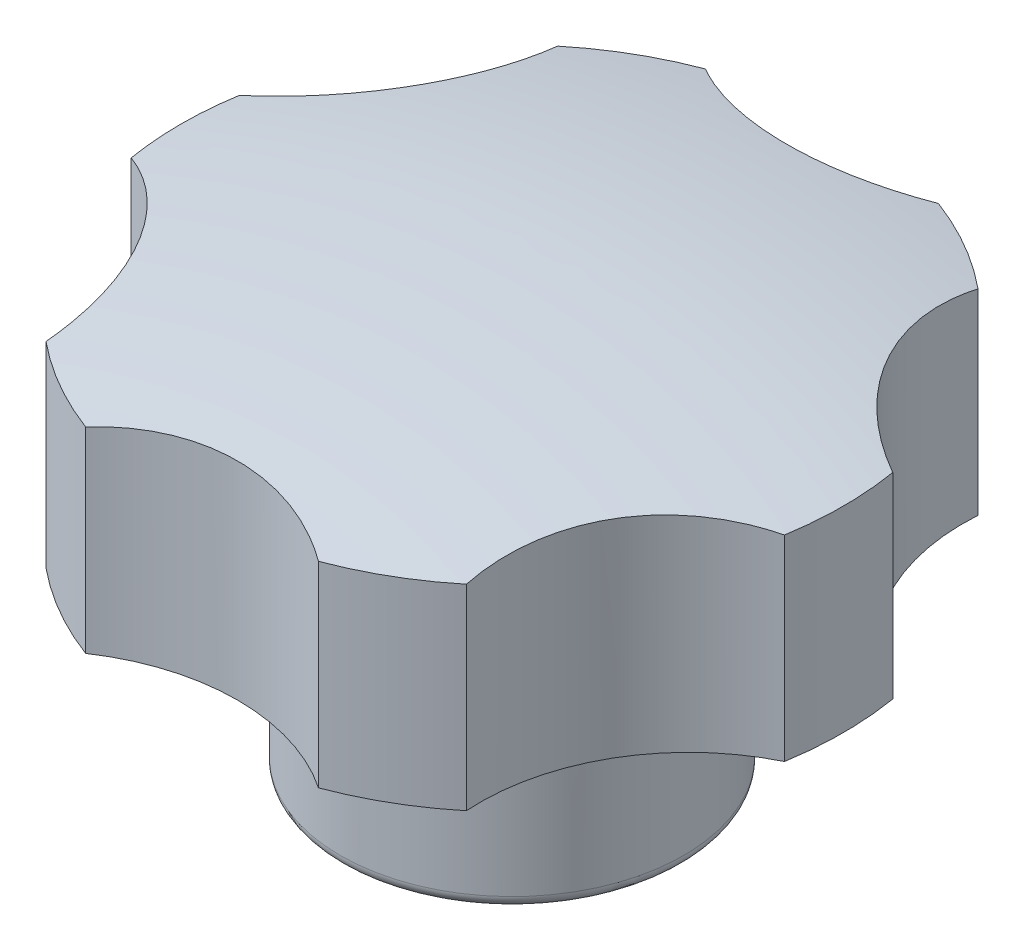
ISO-10303-21;
HEADER;
FILE_DESCRIPTION(('STEP AP214'),'2;1');
FILE_NAME('part.step','',(''),(''),'','','');
FILE_SCHEMA(('AUTOMOTIVE_DESIGN { 1 0 10303 214 1 1 1 1 }'));
ENDSEC;
DATA;
#1=APPLICATION_CONTEXT('core data for automotive mechanical design processes');
#2=APPLICATION_PROTOCOL_DEFINITION('international standard','automotive_design',2000,#1);
#3=PRODUCT_CONTEXT('',#1,'mechanical');
#4=PRODUCT('Part','Part','',(#3));
#5=PRODUCT_RELATED_PRODUCT_CATEGORY('part','',(#4));
#6=PRODUCT_DEFINITION_FORMATION('','',#4);
#7=PRODUCT_DEFINITION_CONTEXT('part definition',#1,'design');
#8=PRODUCT_DEFINITION('design','',#6,#7);
#9=PRODUCT_DEFINITION_SHAPE('','',#8);
#10=(LENGTH_UNIT() NAMED_UNIT(*) SI_UNIT(.MILLI.,.METRE.));
#11=(NAMED_UNIT(*) PLANE_ANGLE_UNIT() SI_UNIT($,.RADIAN.));
#12=(NAMED_UNIT(*) SI_UNIT($,.STERADIAN.) SOLID_ANGLE_UNIT());
#13=UNCERTAINTY_MEASURE_WITH_UNIT(LENGTH_MEASURE(1.E-05),#10,'distance_accuracy_value','');
#14=(GEOMETRIC_REPRESENTATION_CONTEXT(3) GLOBAL_UNCERTAINTY_ASSIGNED_CONTEXT((#13)) GLOBAL_UNIT_ASSIGNED_CONTEXT((#10,
#11,#12)) REPRESENTATION_CONTEXT('',''));
#15=CARTESIAN_POINT('',(0.,0.,0.));
#16=DIRECTION('',(0.,0.,1.));
#17=DIRECTION('',(1.,0.,0.));
#18=AXIS2_PLACEMENT_3D('',#15,#16,#17);
#19=CARTESIAN_POINT('',(0.,0.,0.));
#20=DIRECTION('',(0.,-1.,0.));
#21=DIRECTION('',(0.,0.,-1.));
#22=AXIS2_PLACEMENT_3D('',#19,#20,#21);
#23=CYLINDRICAL_SURFACE('',#22,27.);
#24=CARTESIAN_POINT('',(0.,16.1652468247516,0.));
#25=DIRECTION('',(0.,-1.,0.));
#26=DIRECTION('',(0.,0.,-1.));
#27=AXIS2_PLACEMENT_3D('',#24,#25,#26);
#28=CIRCLE('',#27,27.);
#29=CARTESIAN_POINT('',(-17.1412951219294,16.1652468247516,-20.8608725019573));
#30=VERTEX_POINT('',#29);
#31=CARTESIAN_POINT('',(-9.49539797083318,16.1652468247516,-25.2752332803378));
#32=VERTEX_POINT('',#31);
#33=EDGE_CURVE('E180',#30,#32,#28,.T.);
#34=ORIENTED_EDGE('',*,*,#33,.F.);
#35=DIRECTION('',(0.,-1.,0.));
#36=VECTOR('',#35,1.);
#37=CARTESIAN_POINT('',(-17.1412951219294,35.,-20.8608725019573));
#38=LINE('',#37,#36);
#39=CARTESIAN_POINT('',(-17.1412951219294,32.1652468247516,-20.8608725019573));
#40=VERTEX_POINT('',#39);
#41=EDGE_CURVE('E136',#40,#30,#38,.T.);
#42=ORIENTED_EDGE('',*,*,#41,.F.);
#43=CARTESIAN_POINT('',(0.,32.1652468247516,0.));
#44=DIRECTION('',(0.,-1.,0.));
#45=DIRECTION('',(0.,0.,-1.));
#46=AXIS2_PLACEMENT_3D('',#43,#44,#45);
#47=CIRCLE('',#46,27.);
#48=CARTESIAN_POINT('',(-9.49539797083318,32.1652468247516,-25.2752332803378));
#49=VERTEX_POINT('',#48);
#50=EDGE_CURVE('E175',#40,#49,#47,.T.);
#51=ORIENTED_EDGE('',*,*,#50,.T.);
#52=DIRECTION('',(0.,-1.,0.));
#53=VECTOR('',#52,1.);
#54=CARTESIAN_POINT('',(-9.49539797083318,35.,-25.2752332803378));
#55=LINE('',#54,#53);
#56=EDGE_CURVE('E48',#49,#32,#55,.T.);
#57=ORIENTED_EDGE('',*,*,#56,.T.);
#58=EDGE_LOOP('',(#34,#42,#51,#57));
#59=FACE_BOUND('',#58,.T.);
#60=ADVANCED_FACE('F33',(#59),#23,.T.);
#61=CARTESIAN_POINT('',(9.49539797084144,16.1652468247516,-25.2752332803347));
#62=VERTEX_POINT('',#61);
#63=CARTESIAN_POINT('',(17.1412951219389,16.1652468247516,-20.8608725019495));
#64=VERTEX_POINT('',#63);
#65=EDGE_CURVE('E182',#62,#64,#28,.T.);
#66=ORIENTED_EDGE('',*,*,#65,.F.);
#67=DIRECTION('',(0.,-1.,0.));
#68=VECTOR('',#67,1.);
#69=CARTESIAN_POINT('',(9.49539797084144,35.,-25.2752332803347));
#70=LINE('',#69,#68);
#71=CARTESIAN_POINT('',(9.49539797084144,32.1652468247516,-25.2752332803347));
#72=VERTEX_POINT('',#71);
#73=EDGE_CURVE('E165',#72,#62,#70,.T.);
#74=ORIENTED_EDGE('',*,*,#73,.F.);
#75=CARTESIAN_POINT('',(17.1412951219389,32.1652468247516,-20.8608725019495));
#76=VERTEX_POINT('',#75);
#77=EDGE_CURVE('E177',#72,#76,#47,.T.);
#78=ORIENTED_EDGE('',*,*,#77,.T.);
#79=DIRECTION('',(0.,-1.,0.));
#80=VECTOR('',#79,1.);
#81=CARTESIAN_POINT('',(17.1412951219389,35.,-20.8608725019495));
#82=LINE('',#81,#80);
#83=EDGE_CURVE('E153',#76,#64,#82,.T.);
#84=ORIENTED_EDGE('',*,*,#83,.T.);
#85=EDGE_LOOP('',(#66,#74,#78,#84));
#86=FACE_BOUND('',#85,.T.);
#87=ADVANCED_FACE('F247',(#86),#23,.T.);
#88=CARTESIAN_POINT('',(26.6366930927679,16.1652468247516,-4.41436077837898));
#89=VERTEX_POINT('',#88);
#90=CARTESIAN_POINT('',(26.6366930927656,16.1652468247516,4.41436077839279));
#91=VERTEX_POINT('',#90);
#92=EDGE_CURVE('E186',#89,#91,#28,.T.);
#93=ORIENTED_EDGE('',*,*,#92,.F.);
#94=DIRECTION('',(0.,-1.,0.));
#95=VECTOR('',#94,1.);
#96=CARTESIAN_POINT('',(26.6366930927679,35.,-4.41436077837898));
#97=LINE('',#96,#95);
#98=CARTESIAN_POINT('',(26.6366930927679,32.1652468247516,-4.41436077837898));
#99=VERTEX_POINT('',#98);
#100=EDGE_CURVE('E159',#99,#89,#97,.T.);
#101=ORIENTED_EDGE('',*,*,#100,.F.);
#102=CARTESIAN_POINT('',(26.6366930927656,32.1652468247516,4.41436077839279));
#103=VERTEX_POINT('',#102);
#104=EDGE_CURVE('E181',#99,#103,#47,.T.);
#105=ORIENTED_EDGE('',*,*,#104,.T.);
#106=DIRECTION('',(0.,-1.,0.));
#107=VECTOR('',#106,1.);
#108=CARTESIAN_POINT('',(26.6366930927656,35.,4.41436077839279));
#109=LINE('',#108,#107);
#110=EDGE_CURVE('E144',#103,#91,#109,.T.);
#111=ORIENTED_EDGE('',*,*,#110,.T.);
#112=EDGE_LOOP('',(#93,#101,#105,#111));
#113=FACE_BOUND('',#112,.T.);
#114=ADVANCED_FACE('F253',(#113),#23,.T.);
#115=CARTESIAN_POINT('',(17.1412951219349,16.1652468247516,20.8608725019528));
#116=VERTEX_POINT('',#115);
#117=CARTESIAN_POINT('',(9.49539797082905,16.1652468247516,25.2752332803394));
#118=VERTEX_POINT('',#117);
#119=EDGE_CURVE('E286',#116,#118,#28,.T.);
#120=ORIENTED_EDGE('',*,*,#119,.F.);
#121=DIRECTION('',(0.,-1.,0.));
#122=VECTOR('',#121,1.);
#123=CARTESIAN_POINT('',(17.1412951219349,35.,20.8608725019528));
#124=LINE('',#123,#122);
#125=CARTESIAN_POINT('',(17.1412951219349,32.1652468247516,20.8608725019528));
#126=VERTEX_POINT('',#125);
#127=EDGE_CURVE('E152',#126,#116,#124,.T.);
#128=ORIENTED_EDGE('',*,*,#127,.F.);
#129=CARTESIAN_POINT('',(9.49539797082904,32.1652468247516,25.2752332803394));
#130=VERTEX_POINT('',#129);
#131=EDGE_CURVE('E302',#126,#130,#47,.T.);
#132=ORIENTED_EDGE('',*,*,#131,.T.);
#133=DIRECTION('',(0.,-1.,0.));
#134=VECTOR('',#133,1.);
#135=CARTESIAN_POINT('',(9.49539797082905,35.,25.2752332803394));
#136=LINE('',#135,#134);
#137=EDGE_CURVE('E145',#130,#118,#136,.T.);
#138=ORIENTED_EDGE('',*,*,#137,.T.);
#139=EDGE_LOOP('',(#120,#128,#132,#138));
#140=FACE_BOUND('',#139,.T.);
#141=ADVANCED_FACE('F270',(#140),#23,.T.);
#142=CARTESIAN_POINT('',(-9.49539797082905,16.1652468247516,25.2752332803394));
#143=VERTEX_POINT('',#142);
#144=CARTESIAN_POINT('',(-17.1412951219321,16.1652468247516,20.8608725019551));
#145=VERTEX_POINT('',#144);
#146=EDGE_CURVE('E280',#143,#145,#28,.T.);
#147=ORIENTED_EDGE('',*,*,#146,.F.);
#148=DIRECTION('',(0.,-1.,0.));
#149=VECTOR('',#148,1.);
#150=CARTESIAN_POINT('',(-9.49539797082905,35.,25.2752332803394));
#151=LINE('',#150,#149);
#152=CARTESIAN_POINT('',(-9.49539797082905,32.1652468247516,25.2752332803394));
#153=VERTEX_POINT('',#152);
#154=EDGE_CURVE('E143',#153,#143,#151,.T.);
#155=ORIENTED_EDGE('',*,*,#154,.F.);
#156=CARTESIAN_POINT('',(-17.1412951219321,32.1652468247516,20.8608725019551));
#157=VERTEX_POINT('',#156);
#158=EDGE_CURVE('E299',#153,#157,#47,.T.);
#159=ORIENTED_EDGE('',*,*,#158,.T.);
#160=DIRECTION('',(0.,-1.,0.));
#161=VECTOR('',#160,1.);
#162=CARTESIAN_POINT('',(-17.1412951219321,35.,20.8608725019551));
#163=LINE('',#162,#161);
#164=EDGE_CURVE('E172',#157,#145,#163,.T.);
#165=ORIENTED_EDGE('',*,*,#164,.T.);
#166=EDGE_LOOP('',(#147,#155,#159,#165));
#167=FACE_BOUND('',#166,.T.);
#168=ADVANCED_FACE('F260',(#167),#23,.T.);
#169=CARTESIAN_POINT('',(0.,0.,0.));
#170=DIRECTION('',(0.,1.,0.));
#171=DIRECTION('',(0.,0.,1.));
#172=AXIS2_PLACEMENT_3D('',#169,#170,#171);
#173=PLANE('',#172);
#174=CARTESIAN_POINT('',(0.,0.,0.));
#175=DIRECTION('',(0.,1.,0.));
#176=DIRECTION('',(0.,0.,1.));
#177=AXIS2_PLACEMENT_3D('',#174,#175,#176);
#178=CIRCLE('',#177,13.);
#179=CARTESIAN_POINT('',(0.,0.,13.));
#180=VERTEX_POINT('',#179);
#181=EDGE_CURVE('E41',#180,#180,#178,.F.);
#182=ORIENTED_EDGE('',*,*,#181,.T.);
#183=EDGE_LOOP('',(#182));
#184=FACE_BOUND('',#183,.T.);
#185=CARTESIAN_POINT('',(0.,0.,0.));
#186=DIRECTION('',(0.,-1.,0.));
#187=DIRECTION('',(0.,0.,-1.));
#188=AXIS2_PLACEMENT_3D('',#185,#186,#187);
#189=CIRCLE('',#188,4.99999999999999);
#190=CARTESIAN_POINT('',(0.,0.,-4.99999999999999));
#191=VERTEX_POINT('',#190);
#192=EDGE_CURVE('E134',#191,#191,#189,.T.);
#193=ORIENTED_EDGE('',*,*,#192,.F.);
#194=EDGE_LOOP('',(#193));
#195=FACE_BOUND('',#194,.T.);
#196=ADVANCED_FACE('F236',(#184,#195),#173,.F.);
#197=CARTESIAN_POINT('',(0.,0.,0.));
#198=DIRECTION('',(0.,-1.,0.));
#199=DIRECTION('',(0.,0.,-1.));
#200=AXIS2_PLACEMENT_3D('',#197,#198,#199);
#201=CYLINDRICAL_SURFACE('',#200,14.);
#202=CARTESIAN_POINT('',(0.,1.,0.));
#203=DIRECTION('',(0.,1.,0.));
#204=DIRECTION('',(0.,0.,1.));
#205=AXIS2_PLACEMENT_3D('',#202,#203,#204);
#206=CIRCLE('',#205,14.);
#207=CARTESIAN_POINT('',(0.,1.,14.));
#208=VERTEX_POINT('',#207);
#209=EDGE_CURVE('E11',#208,#208,#206,.T.);
#210=ORIENTED_EDGE('',*,*,#209,.T.);
#211=EDGE_LOOP('',(#210));
#212=FACE_BOUND('',#211,.T.);
#213=CARTESIAN_POINT('',(0.,16.1652468247516,0.));
#214=DIRECTION('',(0.,-1.,0.));
#215=DIRECTION('',(0.,0.,-1.));
#216=AXIS2_PLACEMENT_3D('',#213,#214,#215);
#217=CIRCLE('',#216,14.);
#218=CARTESIAN_POINT('',(0.,16.1652468247516,-14.));
#219=VERTEX_POINT('',#218);
#220=EDGE_CURVE('E185',#219,#219,#217,.T.);
#221=ORIENTED_EDGE('',*,*,#220,.T.);
#222=EDGE_LOOP('',(#221));
#223=FACE_BOUND('',#222,.T.);
#224=ADVANCED_FACE('F266',(#212,#223),#201,.T.);
#225=CARTESIAN_POINT('',(-14.,16.1652468247516,0.));
#226=DIRECTION('',(0.,1.,0.));
#227=DIRECTION('',(0.,0.,1.));
#228=AXIS2_PLACEMENT_3D('',#225,#226,#227);
#229=PLANE('',#228);
#230=ORIENTED_EDGE('',*,*,#220,.F.);
#231=EDGE_LOOP('',(#230));
#232=FACE_BOUND('',#231,.T.);
#233=CARTESIAN_POINT('',(-26.636693092767,16.1652468247516,4.41436077838472));
#234=VERTEX_POINT('',#233);
#235=CARTESIAN_POINT('',(-26.6366930927677,16.1652468247516,-4.41436077837994));
#236=VERTEX_POINT('',#235);
#237=EDGE_CURVE('E287',#234,#236,#28,.T.);
#238=ORIENTED_EDGE('',*,*,#237,.T.);
#239=CARTESIAN_POINT('',(-34.1007942625899,16.1652468247516,-19.6881027470876));
#240=DIRECTION('',(0.,-1.,0.));
#241=DIRECTION('',(0.,0.,-1.));
#242=AXIS2_PLACEMENT_3D('',#239,#240,#241);
#243=CIRCLE('',#242,17.);
#244=EDGE_CURVE('E133',#30,#236,#243,.T.);
#245=ORIENTED_EDGE('',*,*,#244,.F.);
#246=ORIENTED_EDGE('',*,*,#33,.T.);
#247=CARTESIAN_POINT('',(6.43550021581351E-12,16.1652468247516,-39.3762054941738));
#248=DIRECTION('',(0.,-1.,0.));
#249=DIRECTION('',(0.,0.,-1.));
#250=AXIS2_PLACEMENT_3D('',#247,#248,#249);
#251=CIRCLE('',#250,17.);
#252=EDGE_CURVE('E163',#62,#32,#251,.T.);
#253=ORIENTED_EDGE('',*,*,#252,.F.);
#254=ORIENTED_EDGE('',*,*,#65,.T.);
#255=CARTESIAN_POINT('',(34.1007942625995,16.1652468247516,-19.688102747082));
#256=DIRECTION('',(0.,-1.,0.));
#257=DIRECTION('',(0.,0.,-1.));
#258=AXIS2_PLACEMENT_3D('',#255,#256,#257);
#259=CIRCLE('',#258,17.);
#260=EDGE_CURVE('E157',#89,#64,#259,.T.);
#261=ORIENTED_EDGE('',*,*,#260,.F.);
#262=ORIENTED_EDGE('',*,*,#92,.T.);
#263=CARTESIAN_POINT('',(34.1007942625963,16.1652468247516,19.6881027470962));
#264=DIRECTION('',(0.,-1.,0.));
#265=DIRECTION('',(0.,0.,-1.));
#266=AXIS2_PLACEMENT_3D('',#263,#264,#265);
#267=CIRCLE('',#266,17.);
#268=EDGE_CURVE('E150',#116,#91,#267,.T.);
#269=ORIENTED_EDGE('',*,*,#268,.F.);
#270=ORIENTED_EDGE('',*,*,#119,.T.);
#271=CARTESIAN_POINT('',(0.,16.1652468247516,39.3762054941825));
#272=DIRECTION('',(0.,-1.,0.));
#273=DIRECTION('',(0.,0.,-1.));
#274=AXIS2_PLACEMENT_3D('',#271,#272,#273);
#275=CIRCLE('',#274,17.);
#276=EDGE_CURVE('E141',#143,#118,#275,.T.);
#277=ORIENTED_EDGE('',*,*,#276,.F.);
#278=ORIENTED_EDGE('',*,*,#146,.T.);
#279=CARTESIAN_POINT('',(-34.1007942625931,16.1652468247516,19.6881027470906));
#280=DIRECTION('',(0.,-1.,0.));
#281=DIRECTION('',(0.,0.,-1.));
#282=AXIS2_PLACEMENT_3D('',#279,#280,#281);
#283=CIRCLE('',#282,17.0000000000002);
#284=EDGE_CURVE('E148',#234,#145,#283,.T.);
#285=ORIENTED_EDGE('',*,*,#284,.F.);
#286=EDGE_LOOP('',(#238,#245,#246,#253,#254,#261,#262,#269,#270,#277,#278,#285));
#287=FACE_BOUND('',#286,.T.);
#288=ADVANCED_FACE('F258',(#232,#287),#229,.F.);
#289=CARTESIAN_POINT('',(-26.636693092767,32.1652468247516,4.41436077838472));
#290=VERTEX_POINT('',#289);
#291=CARTESIAN_POINT('',(-26.6366930927677,32.1652468247516,-4.41436077837995));
#292=VERTEX_POINT('',#291);
#293=EDGE_CURVE('E298',#290,#292,#47,.T.);
#294=ORIENTED_EDGE('',*,*,#293,.T.);
#295=DIRECTION('',(0.,-1.,0.));
#296=VECTOR('',#295,1.);
#297=CARTESIAN_POINT('',(-26.6366930927677,35.,-4.41436077837994));
#298=LINE('',#297,#296);
#299=EDGE_CURVE('E56',#292,#236,#298,.T.);
#300=ORIENTED_EDGE('',*,*,#299,.T.);
#301=ORIENTED_EDGE('',*,*,#237,.F.);
#302=DIRECTION('',(0.,-1.,0.));
#303=VECTOR('',#302,1.);
#304=CARTESIAN_POINT('',(-26.636693092767,35.,4.41436077838472));
#305=LINE('',#304,#303);
#306=EDGE_CURVE('E171',#290,#234,#305,.T.);
#307=ORIENTED_EDGE('',*,*,#306,.F.);
#308=EDGE_LOOP('',(#294,#300,#301,#307));
#309=FACE_BOUND('',#308,.T.);
#310=ADVANCED_FACE('F249',(#309),#23,.T.);
#311=CARTESIAN_POINT('',(0.,-95.,0.));
#312=DIRECTION('',(0.,-1.,0.));
#313=DIRECTION('',(-1.,0.,0.));
#314=AXIS2_PLACEMENT_3D('',#311,#312,#313);
#315=SPHERICAL_SURFACE('',#314,130.);
#316=ORIENTED_EDGE('',*,*,#50,.F.);
#317=CARTESIAN_POINT('',(-17.1413089533548,32.1652121510978,-20.8610725019573));
#318=CARTESIAN_POINT('',(-17.1255145797256,32.2048026285131,-20.6327145924656));
#319=CARTESIAN_POINT('',(-17.1143215225975,32.2432179222289,-20.4038583896756));
#320=CARTESIAN_POINT('',(-17.1011964850735,32.3176358225257,-19.9454918927008));
#321=CARTESIAN_POINT('',(-17.0992644077085,32.3536384543651,-19.7159816053899));
#322=CARTESIAN_POINT('',(-17.1074464223656,32.4579282788306,-19.0270211313768));
#323=CARTESIAN_POINT('',(-17.1315356454378,32.5225051776713,-18.5670964797044));
#324=CARTESIAN_POINT('',(-17.2171990048723,32.6412379572037,-17.6493171655655));
#325=CARTESIAN_POINT('',(-17.2787785646974,32.6953923286498,-17.1914628122505));
#326=CARTESIAN_POINT('',(-17.3991176487477,32.7684678949679,-16.5088862579109));
#327=CARTESIAN_POINT('',(-17.443893259302,32.7914673938987,-16.2820579034603));
#328=CARTESIAN_POINT('',(-17.5427332519937,32.8347145335311,-15.8301061246717));
#329=CARTESIAN_POINT('',(-17.5968000933005,32.8549614431394,-15.6049831682247));
#330=CARTESIAN_POINT('',(-17.7729552767552,32.9115369650361,-14.9324170421972));
#331=CARTESIAN_POINT('',(-17.9089285462692,32.9436579697478,-14.4881726015592));
#332=CARTESIAN_POINT('',(-18.2170533620672,32.9963936721479,-13.6117099031981));
#333=CARTESIAN_POINT('',(-18.3892044669637,33.0170085102061,-13.1794914988242));
#334=CARTESIAN_POINT('',(-18.6736001245374,33.03917220597,-12.5427727263882));
#335=CARTESIAN_POINT('',(-18.7727488990346,33.0451001885278,-12.3324884901704));
#336=CARTESIAN_POINT('',(-18.9795829056762,33.0540293373181,-11.9161671305966));
#337=CARTESIAN_POINT('',(-19.087265925029,33.0570312595635,-11.7101289236583));
#338=CARTESIAN_POINT('',(-19.4228912774078,33.0616364104333,-11.0988557151433));
#339=CARTESIAN_POINT('',(-19.6634355927642,33.0588410229849,-10.7004046252365));
#340=CARTESIAN_POINT('',(-20.1723796756133,33.0416665001758,-9.93058939298195));
#341=CARTESIAN_POINT('',(-20.4403097171777,33.0274610083695,-9.55890956146367));
#342=CARTESIAN_POINT('',(-21.0049845314164,32.9878019568861,-8.83871836931958));
#343=CARTESIAN_POINT('',(-21.301730775151,32.9623478227329,-8.49020819303064));
#344=CARTESIAN_POINT('',(-21.9218382685189,32.9003915857519,-7.8187360250826));
#345=CARTESIAN_POINT('',(-22.2452013247787,32.8638887325372,-7.49577577055683));
#346=CARTESIAN_POINT('',(-22.9159681865662,32.7801478811328,-6.87764804598892));
#347=CARTESIAN_POINT('',(-23.2633665172398,32.7329123221203,-6.58247428255062));
#348=CARTESIAN_POINT('',(-24.0916845827475,32.6116699062606,-5.93406208665292));
#349=CARTESIAN_POINT('',(-24.5804549235035,32.5339082085966,-5.59142712793948));
#350=CARTESIAN_POINT('',(-25.3360517255873,32.4047623914048,-5.11869901029096));
#351=CARTESIAN_POINT('',(-25.5914016344733,32.3596791735235,-4.96811855605724));
#352=CARTESIAN_POINT('',(-26.1090858515382,32.2654543819552,-4.68076508642112));
#353=CARTESIAN_POINT('',(-26.3714213141916,32.2163121345924,-4.54399437142201));
#354=CARTESIAN_POINT('',(-26.6368930927677,32.1652083242808,-4.41426304231364));
#355=B_SPLINE_CURVE_WITH_KNOTS('',3,(#317,#318,#319,#320,#321,#322,#323,#324,#325,#326,#327,
#328,#329,#330,#331,#332,#333,#334,#335,#336,#337,#338,#339,#340,#341,#342,#343,#344,#345,#346,
#347,#348,#349,#350,#351,#352,#353,#354),.UNSPECIFIED.,.F.,.F.,(4,2,2,2,2,2,2,2,2,2,2,2,2,2,2,2,
2,2,4),(0.,0.696809200819887,1.39361110553178,2.78707845773495,4.18074744095678,
4.87760466648581,5.57464661854575,6.96993945422485,8.36521526762803,9.06271300193537,
9.76003047434168,11.154477018395,12.5280955006402,13.9017841426768,15.2755661013662,
16.649036158087,18.450879160294,19.3500755816263,20.2494215433334),.UNSPECIFIED.);
#356=EDGE_CURVE('E221',#40,#292,#355,.T.);
#357=ORIENTED_EDGE('',*,*,#356,.T.);
#358=ORIENTED_EDGE('',*,*,#293,.F.);
#359=CARTESIAN_POINT('',(-26.636893092767,32.1652083242808,4.41426304231842));
#360=CARTESIAN_POINT('',(-26.4312320148535,32.2047988812383,4.51476340524659));
#361=CARTESIAN_POINT('',(-26.227440054996,32.2432142554198,4.61949777472478));
#362=CARTESIAN_POINT('',(-25.8239202029667,32.3176323183812,4.83731389343643));
#363=CARTESIAN_POINT('',(-25.6241922682636,32.3536350324194,4.95039555525546));
#364=CARTESIAN_POINT('',(-25.0316255163132,32.4579251059214,5.30196087392964));
#365=CARTESIAN_POINT('',(-24.6453633497731,32.522502174023,5.55278459203596));
#366=CARTESIAN_POINT('',(-23.8933740942576,32.6412352975814,6.08585995382062));
#367=CARTESIAN_POINT('',(-23.5276499848269,32.6953898437499,6.36811613991551));
#368=CARTESIAN_POINT('',(-22.9966902804789,32.7684656749676,6.81362046778521));
#369=CARTESIAN_POINT('',(-22.8226387604001,32.7914652626682,6.96581124806128));
#370=CARTESIAN_POINT('',(-22.480656609778,32.8347125806486,7.27738466526203));
#371=CARTESIAN_POINT('',(-22.3127276140227,32.8549595798355,7.43676919794726));
#372=CARTESIAN_POINT('',(-21.8183451894661,32.9115353716442,7.9256065294039));
#373=CARTESIAN_POINT('',(-21.5016043919985,32.9436565576102,8.26548467869115));
#374=CARTESIAN_POINT('',(-20.8966268853161,32.9963926234119,8.97055923661039));
#375=CARTESIAN_POINT('',(-20.6083898284023,33.0170076436183,9.33575533631229));
#376=CARTESIAN_POINT('',(-20.1991722697056,33.0391716120357,9.9004081229622));
#377=CARTESIAN_POINT('',(-20.0666349115117,33.0450996853734,10.0914154497367));
#378=CARTESIAN_POINT('',(-19.8095065259062,33.0540290153522,10.4786993480894));
#379=CARTESIAN_POINT('',(-19.6849134536905,33.0570310280064,10.6749745451218));
#380=CARTESIAN_POINT('',(-19.3233472133798,33.0616364493023,11.2712708388389));
#381=CARTESIAN_POINT('',(-19.0985500685177,33.0588412410972,11.6788136349315));
#382=CARTESIAN_POINT('',(-18.6863414967461,33.0416670710186,12.5044793082155));
#383=CARTESIAN_POINT('',(-18.4984218099629,33.0274617535367,12.922353233531));
#384=CARTESIAN_POINT('',(-18.1570542719767,32.9878030473221,13.7714711862394));
#385=CARTESIAN_POINT('',(-18.0036081819692,32.9623490841127,14.2027158954418));
#386=CARTESIAN_POINT('',(-17.7321488726897,32.9003931843516,15.0754805412995));
#387=CARTESIAN_POINT('',(-17.6141380610909,32.8638904974254,15.5170011739639));
#388=CARTESIAN_POINT('',(-17.4142060658442,32.7801499726246,16.4069659956461));
#389=CARTESIAN_POINT('',(-17.3322766945201,32.7329145739316,16.8554085899866));
#390=CARTESIAN_POINT('',(-17.1848930375528,32.6116725504629,17.8969588205664));
#391=CARTESIAN_POINT('',(-17.1325469055461,32.5339110901276,18.4915635583715));
#392=CARTESIAN_POINT('',(-17.1009496308083,32.4047656284301,19.382293296415));
#393=CARTESIAN_POINT('',(-17.0982177095248,32.3596825288397,19.6787229267267));
#394=CARTESIAN_POINT('',(-17.108203650014,32.2654579734294,20.2707271565486));
#395=CARTESIAN_POINT('',(-17.1209240812339,32.2163158439325,20.5663016056645));
#396=CARTESIAN_POINT('',(-17.1413089533574,32.1652121510978,20.8610725019551));
#397=B_SPLINE_CURVE_WITH_KNOTS('',3,(#359,#360,#361,#362,#363,#364,#365,#366,#367,#368,#369,
#370,#371,#372,#373,#374,#375,#376,#377,#378,#379,#380,#381,#382,#383,#384,#385,#386,#387,#388,
#389,#390,#391,#392,#393,#394,#395,#396),.UNSPECIFIED.,.F.,.F.,(4,2,2,2,2,2,2,2,2,2,2,2,2,2,2,2,
2,2,4),(0.,0.696809272818577,1.39361124955325,2.78707874635645,4.18074788001628,
4.87760518068748,5.57464720794126,6.96994019704359,8.36521616375061,9.06271397404001,
9.76003152240917,11.1544782181979,12.528096755324,13.9017854522601,15.2755674642655,
16.6490375739418,18.4508798671685,19.3500759350622,20.2494215434975),.UNSPECIFIED.);
#398=EDGE_CURVE('E189',#290,#157,#397,.T.);
#399=ORIENTED_EDGE('',*,*,#398,.T.);
#400=ORIENTED_EDGE('',*,*,#158,.F.);
#401=CARTESIAN_POINT('',(-9.49559797082905,32.1652051218519,25.2753679596108));
#402=CARTESIAN_POINT('',(-9.3057316972762,32.2047957451882,25.1475102118828));
#403=CARTESIAN_POINT('',(-9.11313322111031,32.2432111865321,25.0233881683211));
#404=CARTESIAN_POINT('',(-8.72273925058265,32.3176293852917,24.782837351603));
#405=CARTESIAN_POINT('',(-8.52494381065829,32.3536321679655,24.6664084979065));
#406=CARTESIAN_POINT('',(-7.92419628115765,32.4579224494517,24.3290126311568));
#407=CARTESIAN_POINT('',(-7.51384569630391,32.5224996589653,24.1199111878217));
#408=CARTESIAN_POINT('',(-6.6761946380316,32.6412330706113,23.7352061437904));
#409=CARTESIAN_POINT('',(-6.24889172031457,32.6953877633219,23.5596073950919));
#410=CARTESIAN_POINT('',(-5.59759401776545,32.7684638166357,23.3225342497395));
#411=CARTESIAN_POINT('',(-5.37876724218773,32.7914634787494,23.2478963615024));
#412=CARTESIAN_POINT('',(-4.93794579450849,32.8347109462072,23.1075173567047));
#413=CARTESIAN_POINT('',(-4.71595029802124,32.8549580204584,23.0417786037921));
#414=CARTESIAN_POINT('',(-4.04541368809666,32.9115340384254,22.858048798355));
#415=CARTESIAN_POINT('',(-3.5927002555187,32.9436553762105,22.7536818037215));
#416=CARTESIAN_POINT('',(-2.67959913415483,32.9963917462758,22.5822922057186));
#417=CARTESIAN_POINT('',(-2.2192115390618,33.0170069189275,22.5152691467653));
#418=CARTESIAN_POINT('',(-1.52559912091273,33.0391711153656,22.4432019974975));
#419=CARTESIAN_POINT('',(-1.29391324696868,33.0450992645858,22.4239246950498));
#420=CARTESIAN_POINT('',(-0.829951353517562,33.0540287460505,22.394886437711));
#421=CARTESIAN_POINT('',(-0.597675502002892,33.0570308343082,22.3851230246945));
#422=CARTESIAN_POINT('',(0.0995153993548197,33.0616364817953,22.3701448866923));
#423=CARTESIAN_POINT('',(0.56485643692359,33.0588414235746,22.3792357587701));
#424=CARTESIAN_POINT('',(1.48600828344357,33.0416675488361,22.4350845403078));
#425=CARTESIAN_POINT('',(1.94185762321255,33.0274623775178,22.4812778052361));
#426=CARTESIAN_POINT('',(2.84789927328066,32.9878039612008,22.6102028800165));
#427=CARTESIAN_POINT('',(3.29809129345863,32.9623501417452,22.6929365559492));
#428=CARTESIAN_POINT('',(4.18965755917313,32.9003945249235,22.8942273035808));
#429=CARTESIAN_POINT('',(4.63103120339556,32.8638919768806,23.0127868093702));
#430=CARTESIAN_POINT('',(5.50172969096427,32.7801517248046,23.2846221514181));
#431=CARTESIAN_POINT('',(5.93105724702731,32.7329164598799,23.4378900998378));
#432=CARTESIAN_POINT('',(6.90676753316237,32.6116736173806,23.8310298860993));
#433=CARTESIAN_POINT('',(7.44789232215859,32.5339109098055,24.0830032182931));
#434=CARTESIAN_POINT('',(8.23509809201599,32.404763172759,24.5010114036619));
#435=CARTESIAN_POINT('',(8.49318369062958,32.35967924742,24.6468629738471));
#436=CARTESIAN_POINT('',(9.00088921936529,32.265452912504,24.9515189104817));
#437=CARTESIAN_POINT('',(9.25050773451314,32.2163098292497,25.1103254269415));
#438=CARTESIAN_POINT('',(9.49559797082905,32.1652051218519,25.2753679596108));
#439=B_SPLINE_CURVE_WITH_KNOTS('',3,(#401,#402,#403,#404,#405,#406,#407,#408,#409,#410,#411,
#412,#413,#414,#415,#416,#417,#418,#419,#420,#421,#422,#423,#424,#425,#426,#427,#428,#429,#430,
#431,#432,#433,#434,#435,#436,#437,#438),.UNSPECIFIED.,.F.,.F.,(4,2,2,2,2,2,2,2,2,2,2,2,2,2,2,2,
2,2,4),(0.,0.69680932981171,1.39361136355789,2.7870789748441,4.18074824089128,4.87760560771667,
5.57464770117072,6.96994082596388,8.36521692825801,9.06271479833532,9.760032406472,
11.1544792222351,12.5280977852499,13.9017865056426,15.2755685786531,16.6490387587815,
18.4509104491073,19.3501212178091,20.2494815248489),.UNSPECIFIED.);
#440=EDGE_CURVE('E198',#153,#130,#439,.T.);
#441=ORIENTED_EDGE('',*,*,#440,.T.);
#442=ORIENTED_EDGE('',*,*,#131,.F.);
#443=CARTESIAN_POINT('',(17.1413089533603,32.1652121510978,20.8610725019528));
#444=CARTESIAN_POINT('',(17.1255145797313,32.2048026285131,20.6327145924611));
#445=CARTESIAN_POINT('',(17.1143215226034,32.2432179222289,20.4038583896711));
#446=CARTESIAN_POINT('',(17.1011964850797,32.3176358225256,19.9454918926963));
#447=CARTESIAN_POINT('',(17.0992644077149,32.353638454365,19.7159816053854));
#448=CARTESIAN_POINT('',(17.1074464223725,32.4579282788304,19.0270211313724));
#449=CARTESIAN_POINT('',(17.1315356454451,32.522505177671,18.5670964797));
#450=CARTESIAN_POINT('',(17.2171990048802,32.6412379572032,17.6493171655611));
#451=CARTESIAN_POINT('',(17.2787785647057,32.6953923286493,17.1914628122463));
#452=CARTESIAN_POINT('',(17.3991176487566,32.7684678949672,16.5088862579068));
#453=CARTESIAN_POINT('',(17.443893259311,32.791467393898,16.2820579034562));
#454=CARTESIAN_POINT('',(17.542733252003,32.8347145335303,15.8301061246677));
#455=CARTESIAN_POINT('',(17.59680009331,32.8549614431386,15.6049831682208));
#456=CARTESIAN_POINT('',(17.7729552767652,32.9115369650351,14.9324170421935));
#457=CARTESIAN_POINT('',(17.9089285462795,32.9436579697467,14.4881726015556));
#458=CARTESIAN_POINT('',(18.2170533620782,32.9963936721467,13.6117099031948));
#459=CARTESIAN_POINT('',(18.389204466975,33.0170085102048,13.1794914988211));
#460=CARTESIAN_POINT('',(18.6736001245492,33.0391722059686,12.5427727263852));
#461=CARTESIAN_POINT('',(18.7727488990466,33.0451001885263,12.3324884901676));
#462=CARTESIAN_POINT('',(18.9795829056885,33.0540293373165,11.9161671305939));
#463=CARTESIAN_POINT('',(19.0872659250414,33.0570312595619,11.7101289236557));
#464=CARTESIAN_POINT('',(19.4228912774206,33.0616364104316,11.0988557151411));
#465=CARTESIAN_POINT('',(19.6634355927773,33.058841022983,10.7004046252344));
#466=CARTESIAN_POINT('',(20.1723796756269,33.0416665001738,9.93058939298031));
#467=CARTESIAN_POINT('',(20.4403097171916,33.0274610083674,9.55890956146224));
#468=CARTESIAN_POINT('',(21.0049845314308,32.9878019568838,8.8387183693186));
#469=CARTESIAN_POINT('',(21.3017307751656,32.9623478227305,8.4902081930299));
#470=CARTESIAN_POINT('',(21.9218382685341,32.9003915857493,7.81873602508235));
#471=CARTESIAN_POINT('',(22.2452013247941,32.8638887325345,7.49577577055684));
#472=CARTESIAN_POINT('',(22.9159681865819,32.7801478811299,6.87764804598946));
#473=CARTESIAN_POINT('',(23.2633665172558,32.7329123221173,6.58247428255143));
#474=CARTESIAN_POINT('',(24.091684582761,32.6116699062578,5.93406208665661));
#475=CARTESIAN_POINT('',(24.5804549235141,32.5339082085942,5.59142712794547));
#476=CARTESIAN_POINT('',(25.3360517255933,32.4047623914032,5.1186990102999));
#477=CARTESIAN_POINT('',(25.5914016344777,32.3596791735222,4.96811855606708));
#478=CARTESIAN_POINT('',(26.1090858515394,32.2654543819545,4.6807650864326));
#479=CARTESIAN_POINT('',(26.3714213141912,32.2163121345921,4.54399437143422));
#480=CARTESIAN_POINT('',(26.6368930927656,32.1652083242808,4.41426304232649));
#481=B_SPLINE_CURVE_WITH_KNOTS('',3,(#443,#444,#445,#446,#447,#448,#449,#450,#451,#452,#453,
#454,#455,#456,#457,#458,#459,#460,#461,#462,#463,#464,#465,#466,#467,#468,#469,#470,#471,#472,
#473,#474,#475,#476,#477,#478,#479,#480),.UNSPECIFIED.,.F.,.F.,(4,2,2,2,2,2,2,2,2,2,2,2,2,2,2,2,
2,2,4),(0.,0.696809200819843,1.39361110553169,2.78707845773477,4.1807474409565,4.87760466648548,
5.57464661854537,6.96993945422437,8.36521526762746,9.06271300193475,9.76003047434102,
11.1544770183942,12.5280955006394,13.901784142676,15.2755661013652,16.649036158086,
18.450879160282,19.3500755816088,20.2494215433104),.UNSPECIFIED.);
#482=EDGE_CURVE('E316',#126,#103,#481,.T.);
#483=ORIENTED_EDGE('',*,*,#482,.T.);
#484=ORIENTED_EDGE('',*,*,#104,.F.);
#485=CARTESIAN_POINT('',(26.6368930927679,32.1652083242808,-4.41426304231268));
#486=CARTESIAN_POINT('',(26.4312320148545,32.2047988812383,-4.51476340524091));
#487=CARTESIAN_POINT('',(26.2274400549971,32.2432142554198,-4.61949777471918));
#488=CARTESIAN_POINT('',(25.8239202029679,32.3176323183812,-4.83731389343098));
#489=CARTESIAN_POINT('',(25.6241922682647,32.3536350324193,-4.95039555525008));
#490=CARTESIAN_POINT('',(25.0316255163145,32.4579251059213,-5.30196087392447));
#491=CARTESIAN_POINT('',(24.6453633497745,32.5225021740229,-5.55278459203092));
#492=CARTESIAN_POINT('',(23.8933740942593,32.6412352975814,-6.08585995381585));
#493=CARTESIAN_POINT('',(23.5276499848286,32.6953898437498,-6.36811613991085));
#494=CARTESIAN_POINT('',(22.9966902804808,32.7684656749675,-6.81362046778074));
#495=CARTESIAN_POINT('',(22.8226387604021,32.7914652626681,-6.96581124805687));
#496=CARTESIAN_POINT('',(22.4806566097801,32.8347125806485,-7.27738466525774));
#497=CARTESIAN_POINT('',(22.3127276140249,32.8549595798354,-7.43676919794303));
#498=CARTESIAN_POINT('',(21.8183451894684,32.911535371644,-7.92560652939983));
#499=CARTESIAN_POINT('',(21.5016043920009,32.94365655761,-8.26548467868719));
#500=CARTESIAN_POINT('',(20.8966268853188,32.9963926234117,-8.97055923660663));
#501=CARTESIAN_POINT('',(20.6083898284051,33.0170076436181,-9.33575533630862));
#502=CARTESIAN_POINT('',(20.1991722697087,33.0391716120355,-9.90040812295867));
#503=CARTESIAN_POINT('',(20.0666349115149,33.0450996853731,-10.0914154497332));
#504=CARTESIAN_POINT('',(19.8095065259095,33.054029015352,-10.478699348086));
#505=CARTESIAN_POINT('',(19.6849134536939,33.0570310280062,-10.6749745451184));
#506=CARTESIAN_POINT('',(19.3233472133834,33.0616364493021,-11.2712708388357));
#507=CARTESIAN_POINT('',(19.0985500685215,33.058841241097,-11.6788136349283));
#508=CARTESIAN_POINT('',(18.6863414967502,33.0416670710183,-12.5044793082124));
#509=CARTESIAN_POINT('',(18.4984218099671,33.0274617535365,-12.922353233528));
#510=CARTESIAN_POINT('',(18.1570542719812,32.9878030473218,-13.7714711862365));
#511=CARTESIAN_POINT('',(18.0036081819739,32.9623490841124,-14.202715895439));
#512=CARTESIAN_POINT('',(17.7321488726947,32.9003931843513,-15.0754805412967));
#513=CARTESIAN_POINT('',(17.614138061096,32.863890497425,-15.5170011739611));
#514=CARTESIAN_POINT('',(17.4142060658496,32.7801499726243,-16.4069659956435));
#515=CARTESIAN_POINT('',(17.3322766945258,32.7329145739312,-16.8554085899839));
#516=CARTESIAN_POINT('',(17.1848930375589,32.6116725504626,-17.8969588205633));
#517=CARTESIAN_POINT('',(17.1325469055524,32.5339110901273,-18.4915635583679));
#518=CARTESIAN_POINT('',(17.1009496308149,32.4047656284298,-19.3822932964106));
#519=CARTESIAN_POINT('',(17.0982177095315,32.3596825288395,-19.6787229267221));
#520=CARTESIAN_POINT('',(17.1082036500207,32.2654579734292,-20.2707271565434));
#521=CARTESIAN_POINT('',(17.1209240812407,32.2163158439325,-20.5663016056592));
#522=CARTESIAN_POINT('',(17.1413089533643,32.1652121510978,-20.8610725019495));
#523=B_SPLINE_CURVE_WITH_KNOTS('',3,(#485,#486,#487,#488,#489,#490,#491,#492,#493,#494,#495,
#496,#497,#498,#499,#500,#501,#502,#503,#504,#505,#506,#507,#508,#509,#510,#511,#512,#513,#514,
#515,#516,#517,#518,#519,#520,#521,#522),.UNSPECIFIED.,.F.,.F.,(4,2,2,2,2,2,2,2,2,2,2,2,2,2,2,2,
2,2,4),(0.,0.696809272818556,1.39361124955321,2.78707874635638,4.18074788001617,
4.87760518068736,5.57464720794113,6.96994019704342,8.36521616375041,9.0627139740398,
9.76003152240894,11.1544782181976,12.5280967553237,13.9017854522598,15.2755674642651,
16.6490375739414,18.4508798671666,19.3500759350595,20.249421543494),.UNSPECIFIED.);
#524=EDGE_CURVE('E315',#99,#76,#523,.T.);
#525=ORIENTED_EDGE('',*,*,#524,.T.);
#526=ORIENTED_EDGE('',*,*,#77,.F.);
#527=CARTESIAN_POINT('',(9.49559797084144,32.1652051218519,-25.2753679596061));
#528=CARTESIAN_POINT('',(9.30573169728863,32.2047957451882,-25.147510211878));
#529=CARTESIAN_POINT('',(9.11313322112278,32.2432111865322,-25.0233881683162));
#530=CARTESIAN_POINT('',(8.72273925059521,32.3176293852918,-24.782837351598));
#531=CARTESIAN_POINT('',(8.5249438106709,32.3536321679657,-24.6664084979014));
#532=CARTESIAN_POINT('',(7.92419628117038,32.4579224494519,-24.3290126311514));
#533=CARTESIAN_POINT('',(7.51384569631671,32.5224996589655,-24.1199111878162));
#534=CARTESIAN_POINT('',(6.67619463804452,32.6412330706116,-23.7352061437845));
#535=CARTESIAN_POINT('',(6.24889172032754,32.6953877633224,-23.5596073950858));
#536=CARTESIAN_POINT('',(5.59759401777849,32.7684638166363,-23.3225342497331));
#537=CARTESIAN_POINT('',(5.37876724220079,32.79146347875,-23.2478963614959));
#538=CARTESIAN_POINT('',(4.93794579452158,32.8347109462078,-23.1075173566981));
#539=CARTESIAN_POINT('',(4.71595029803435,32.8549580204591,-23.0417786037854));
#540=CARTESIAN_POINT('',(4.04541368810982,32.9115340384262,-22.858048798348));
#541=CARTESIAN_POINT('',(3.59270025553188,32.9436553762114,-22.7536818037143));
#542=CARTESIAN_POINT('',(2.67959913416803,32.9963917462769,-22.582292205711));
#543=CARTESIAN_POINT('',(2.219211539075,33.0170069189287,-22.5152691467576));
#544=CARTESIAN_POINT('',(1.52559912092591,33.0391711153669,-22.4432019974894));
#545=CARTESIAN_POINT('',(1.29391324698186,33.0450992645871,-22.4239246950416));
#546=CARTESIAN_POINT('',(0.829951353530725,33.0540287460519,-22.3948864377026));
#547=CARTESIAN_POINT('',(0.597675502016045,33.0570308343096,-22.3851230246861));
#548=CARTESIAN_POINT('',(-0.0995153993417007,33.0616364817968,-22.3701448866836));
#549=CARTESIAN_POINT('',(-0.564856436910502,33.0588414235762,-22.3792357587612));
#550=CARTESIAN_POINT('',(-1.48600828343055,33.0416675488378,-22.4350845402986));
#551=CARTESIAN_POINT('',(-1.94185762319957,33.0274623775197,-22.4812778052267));
#552=CARTESIAN_POINT('',(-2.84789927326776,32.9878039612028,-22.6102028800067));
#553=CARTESIAN_POINT('',(-3.29809129344578,32.9623501417473,-22.6929365559393));
#554=CARTESIAN_POINT('',(-4.1896575591604,32.9003945249257,-22.8942273035705));
#555=CARTESIAN_POINT('',(-4.63103120338291,32.863891976883,-23.0127868093598));
#556=CARTESIAN_POINT('',(-5.50172969095176,32.7801517248071,-23.2846221514074));
#557=CARTESIAN_POINT('',(-5.93105724701489,32.7329164598824,-23.4378900998269));
#558=CARTESIAN_POINT('',(-6.90676753315309,32.6116736173829,-23.8310298860892));
#559=CARTESIAN_POINT('',(-7.44789232215225,32.5339109098075,-24.0830032182843));
#560=CARTESIAN_POINT('',(-8.23509809201379,32.4047631727603,-24.5010114036555));
#561=CARTESIAN_POINT('',(-8.49318369062871,32.3596792474211,-24.6468629738416));
#562=CARTESIAN_POINT('',(-9.00088921936699,32.2654529125045,-24.9515189104781));
#563=CARTESIAN_POINT('',(-9.25050773451609,32.21630982925,-25.1103254269388));
#564=CARTESIAN_POINT('',(-9.49559797083318,32.1652051218519,-25.2753679596092));
#565=B_SPLINE_CURVE_WITH_KNOTS('',3,(#527,#528,#529,#530,#531,#532,#533,#534,#535,#536,#537,
#538,#539,#540,#541,#542,#543,#544,#545,#546,#547,#548,#549,#550,#551,#552,#553,#554,#555,#556,
#557,#558,#559,#560,#561,#562,#563,#564),.UNSPECIFIED.,.F.,.F.,(4,2,2,2,2,2,2,2,2,2,2,2,2,2,2,2,
2,2,4),(0.,0.696809329811751,1.39361136355796,2.78707897484426,4.18074824089152,
4.87760560771696,5.57464770117105,6.9699408259643,8.36521692825852,9.06271479833587,
9.76003240647259,11.1544792222358,12.5280977852507,13.9017865056433,15.2755685786539,
16.6490387587823,18.4509104491178,19.3501212178245,20.249481524869),.UNSPECIFIED.);
#566=EDGE_CURVE('E227',#72,#49,#565,.T.);
#567=ORIENTED_EDGE('',*,*,#566,.T.);
#568=EDGE_LOOP('',(#316,#357,#358,#399,#400,#441,#442,#483,#484,#525,#526,#567));
#569=FACE_BOUND('',#568,.T.);
#570=ADVANCED_FACE('F205',(#569),#315,.T.);
#571=CARTESIAN_POINT('',(-34.1007942625931,35.,19.6881027470906));
#572=DIRECTION('',(0.,-1.,0.));
#573=DIRECTION('',(0.,0.,-1.));
#574=AXIS2_PLACEMENT_3D('',#571,#572,#573);
#575=CYLINDRICAL_SURFACE('',#574,17.0000000000002);
#576=ORIENTED_EDGE('',*,*,#306,.T.);
#577=ORIENTED_EDGE('',*,*,#284,.T.);
#578=ORIENTED_EDGE('',*,*,#164,.F.);
#579=ORIENTED_EDGE('',*,*,#398,.F.);
#580=EDGE_LOOP('',(#576,#577,#578,#579));
#581=FACE_BOUND('',#580,.T.);
#582=ADVANCED_FACE('F208',(#581),#575,.F.);
#583=CARTESIAN_POINT('',(0.,35.,39.3762054941825));
#584=DIRECTION('',(0.,-1.,0.));
#585=DIRECTION('',(0.,0.,-1.));
#586=AXIS2_PLACEMENT_3D('',#583,#584,#585);
#587=CYLINDRICAL_SURFACE('',#586,17.);
#588=ORIENTED_EDGE('',*,*,#154,.T.);
#589=ORIENTED_EDGE('',*,*,#276,.T.);
#590=ORIENTED_EDGE('',*,*,#137,.F.);
#591=ORIENTED_EDGE('',*,*,#440,.F.);
#592=EDGE_LOOP('',(#588,#589,#590,#591));
#593=FACE_BOUND('',#592,.T.);
#594=ADVANCED_FACE('F212',(#593),#587,.F.);
#595=CARTESIAN_POINT('',(34.1007942625963,35.,19.6881027470962));
#596=DIRECTION('',(0.,-1.,0.));
#597=DIRECTION('',(0.,0.,-1.));
#598=AXIS2_PLACEMENT_3D('',#595,#596,#597);
#599=CYLINDRICAL_SURFACE('',#598,17.);
#600=ORIENTED_EDGE('',*,*,#127,.T.);
#601=ORIENTED_EDGE('',*,*,#268,.T.);
#602=ORIENTED_EDGE('',*,*,#110,.F.);
#603=ORIENTED_EDGE('',*,*,#482,.F.);
#604=EDGE_LOOP('',(#600,#601,#602,#603));
#605=FACE_BOUND('',#604,.T.);
#606=ADVANCED_FACE('F328',(#605),#599,.F.);
#607=CARTESIAN_POINT('',(34.1007942625995,35.,-19.688102747082));
#608=DIRECTION('',(0.,-1.,0.));
#609=DIRECTION('',(0.,0.,-1.));
#610=AXIS2_PLACEMENT_3D('',#607,#608,#609);
#611=CYLINDRICAL_SURFACE('',#610,17.);
#612=ORIENTED_EDGE('',*,*,#100,.T.);
#613=ORIENTED_EDGE('',*,*,#260,.T.);
#614=ORIENTED_EDGE('',*,*,#83,.F.);
#615=ORIENTED_EDGE('',*,*,#524,.F.);
#616=EDGE_LOOP('',(#612,#613,#614,#615));
#617=FACE_BOUND('',#616,.T.);
#618=ADVANCED_FACE('F331',(#617),#611,.F.);
#619=CARTESIAN_POINT('',(6.43550021581351E-12,35.,-39.3762054941738));
#620=DIRECTION('',(0.,-1.,0.));
#621=DIRECTION('',(0.,0.,-1.));
#622=AXIS2_PLACEMENT_3D('',#619,#620,#621);
#623=CYLINDRICAL_SURFACE('',#622,17.);
#624=ORIENTED_EDGE('',*,*,#73,.T.);
#625=ORIENTED_EDGE('',*,*,#252,.T.);
#626=ORIENTED_EDGE('',*,*,#56,.F.);
#627=ORIENTED_EDGE('',*,*,#566,.F.);
#628=EDGE_LOOP('',(#624,#625,#626,#627));
#629=FACE_BOUND('',#628,.T.);
#630=ADVANCED_FACE('F217',(#629),#623,.F.);
#631=CARTESIAN_POINT('',(-34.1007942625899,35.,-19.6881027470876));
#632=DIRECTION('',(0.,-1.,0.));
#633=DIRECTION('',(0.,0.,-1.));
#634=AXIS2_PLACEMENT_3D('',#631,#632,#633);
#635=CYLINDRICAL_SURFACE('',#634,17.);
#636=ORIENTED_EDGE('',*,*,#41,.T.);
#637=ORIENTED_EDGE('',*,*,#244,.T.);
#638=ORIENTED_EDGE('',*,*,#299,.F.);
#639=ORIENTED_EDGE('',*,*,#356,.F.);
#640=EDGE_LOOP('',(#636,#637,#638,#639));
#641=FACE_BOUND('',#640,.T.);
#642=ADVANCED_FACE('F127',(#641),#635,.F.);
#643=CARTESIAN_POINT('',(0.,16.9956969048622,0.));
#644=DIRECTION('',(0.,-1.,0.));
#645=DIRECTION('',(0.,0.,-1.));
#646=AXIS2_PLACEMENT_3D('',#643,#644,#645);
#647=CONICAL_SURFACE('',#646,5.,1.02974425867665);
#648=CARTESIAN_POINT('',(0.,20.,0.));
#649=VERTEX_POINT('',#648);
#650=VERTEX_LOOP('',#649);
#651=FACE_BOUND('',#650,.T.);
#652=CARTESIAN_POINT('',(0.,16.9956969048622,0.));
#653=DIRECTION('',(0.,-1.,0.));
#654=DIRECTION('',(0.,0.,-1.));
#655=AXIS2_PLACEMENT_3D('',#652,#653,#654);
#656=CIRCLE('',#655,5.);
#657=CARTESIAN_POINT('',(0.,16.9956969048622,-5.));
#658=VERTEX_POINT('',#657);
#659=EDGE_CURVE('E131',#658,#658,#656,.T.);
#660=ORIENTED_EDGE('',*,*,#659,.T.);
#661=EDGE_LOOP('',(#660));
#662=FACE_BOUND('',#661,.T.);
#663=ADVANCED_FACE('F123',(#651,#662),#647,.F.);
#664=CARTESIAN_POINT('',(0.,0.,0.));
#665=DIRECTION('',(0.,-1.,0.));
#666=DIRECTION('',(0.,0.,-1.));
#667=AXIS2_PLACEMENT_3D('',#664,#665,#666);
#668=CYLINDRICAL_SURFACE('',#667,4.99999999999999);
#669=ORIENTED_EDGE('',*,*,#659,.F.);
#670=EDGE_LOOP('',(#669));
#671=FACE_BOUND('',#670,.T.);
#672=ORIENTED_EDGE('',*,*,#192,.T.);
#673=EDGE_LOOP('',(#672));
#674=FACE_BOUND('',#673,.T.);
#675=ADVANCED_FACE('F126',(#671,#674),#668,.F.);
#676=CARTESIAN_POINT('',(0.,1.,0.));
#677=DIRECTION('',(0.,1.,0.));
#678=DIRECTION('',(0.,0.,1.));
#679=AXIS2_PLACEMENT_3D('',#676,#677,#678);
#680=TOROIDAL_SURFACE('',#679,13.,1.);
#681=ORIENTED_EDGE('',*,*,#209,.F.);
#682=EDGE_LOOP('',(#681));
#683=FACE_BOUND('',#682,.T.);
#684=ORIENTED_EDGE('',*,*,#181,.F.);
#685=EDGE_LOOP('',(#684));
#686=FACE_BOUND('',#685,.T.);
#687=ADVANCED_FACE('F35',(#683,#686),#680,.T.);
#688=CLOSED_SHELL('',(#60,#87,#114,#141,#168,#196,#224,#288,#310,#570,#582,#594,#606,#618,#630,
#642,#663,#675,#687));
#689=MANIFOLD_SOLID_BREP('B2',#688);
#690=ADVANCED_BREP_SHAPE_REPRESENTATION('',(#18,#689),#14);
#691=SHAPE_DEFINITION_REPRESENTATION(#9,#690);
ENDSEC;
END-ISO-10303-21;
